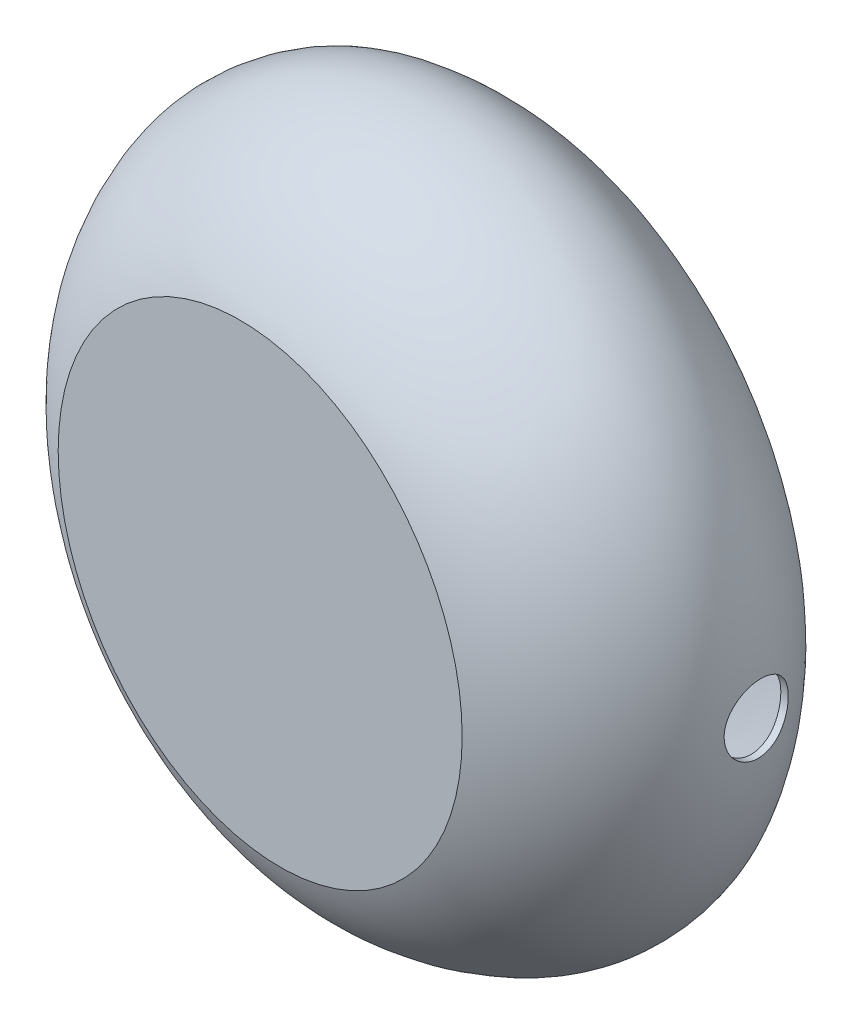
ISO-10303-21;
HEADER;
FILE_DESCRIPTION(('STEP AP214'),'2;1');
FILE_NAME('part.step','',(''),(''),'','','');
FILE_SCHEMA(('AUTOMOTIVE_DESIGN { 1 0 10303 214 1 1 1 1 }'));
ENDSEC;
DATA;
#1=APPLICATION_CONTEXT('core data for automotive mechanical design processes');
#2=APPLICATION_PROTOCOL_DEFINITION('international standard','automotive_design',2000,#1);
#3=PRODUCT_CONTEXT('',#1,'mechanical');
#4=PRODUCT('Part','Part','',(#3));
#5=PRODUCT_RELATED_PRODUCT_CATEGORY('part','',(#4));
#6=PRODUCT_DEFINITION_FORMATION('','',#4);
#7=PRODUCT_DEFINITION_CONTEXT('part definition',#1,'design');
#8=PRODUCT_DEFINITION('design','',#6,#7);
#9=PRODUCT_DEFINITION_SHAPE('','',#8);
#10=(LENGTH_UNIT() NAMED_UNIT(*) SI_UNIT(.MILLI.,.METRE.));
#11=(NAMED_UNIT(*) PLANE_ANGLE_UNIT() SI_UNIT($,.RADIAN.));
#12=(NAMED_UNIT(*) SI_UNIT($,.STERADIAN.) SOLID_ANGLE_UNIT());
#13=UNCERTAINTY_MEASURE_WITH_UNIT(LENGTH_MEASURE(1.E-05),#10,'distance_accuracy_value','');
#14=(GEOMETRIC_REPRESENTATION_CONTEXT(3) GLOBAL_UNCERTAINTY_ASSIGNED_CONTEXT((#13)) GLOBAL_UNIT_ASSIGNED_CONTEXT((#10,
#11,#12)) REPRESENTATION_CONTEXT('',''));
#15=CARTESIAN_POINT('',(0.,0.,0.));
#16=DIRECTION('',(0.,0.,1.));
#17=DIRECTION('',(1.,0.,0.));
#18=AXIS2_PLACEMENT_3D('',#15,#16,#17);
#19=CARTESIAN_POINT('',(10.9564172881335,0.,-41.4839206738087));
#20=CARTESIAN_POINT('',(16.7468170504935,0.,-39.8909410594247));
#21=CARTESIAN_POINT('',(24.4852706866185,0.,-37.3646570897723));
#22=CARTESIAN_POINT('',(29.4107737267656,0.,-31.1887789553887));
#23=CARTESIAN_POINT('',(30.237298128489,0.,-30.0002177019345));
#24=CARTESIAN_POINT('',(31.4004463307205,0.,-28.3275836183976));
#25=CARTESIAN_POINT('',(33.4006873198036,0.,-24.7555768155637));
#26=CARTESIAN_POINT('',(33.4337047002465,0.,-17.1975446517113));
#27=CARTESIAN_POINT('',(31.7953844898338,0.,-13.4401225330892));
#28=CARTESIAN_POINT('',(30.7823011503992,0.,-11.6725590504601));
#29=CARTESIAN_POINT('',(27.2189655886825,0.,-5.45547742442256));
#30=CARTESIAN_POINT('',(21.6184989610074,0.,-0.985104081791563));
#31=CARTESIAN_POINT('',(14.766271873074,0.,1.11166681785368));
#32=(BOUNDED_CURVE() B_SPLINE_CURVE(3,(#19,#20,#21,#22,#23,#24,#25,#26,#27,#28,#29,#30,#31),
.UNSPECIFIED.,.F.,.F.) B_SPLINE_CURVE_WITH_KNOTS((4,1,3,1,1,3,4),(0.,0.295285165363987,
0.366179967123908,0.465948541460828,0.565717115797749,0.66548569013467,1.),
.UNSPECIFIED.) CURVE() GEOMETRIC_REPRESENTATION_ITEM() RATIONAL_B_SPLINE_CURVE((1.,1.,1.,1.,1.,
1.,1.,1.,1.,1.,0.95325564469818,0.95325564469818,1.)) REPRESENTATION_ITEM(''));
#33=CARTESIAN_POINT('',(-17.3903051150952,0.,-2.12458306115281));
#34=DIRECTION('',(0.100134544269236,0.,-0.994973905710091));
#35=AXIS1_PLACEMENT('',#33,#34);
#36=SURFACE_OF_REVOLUTION('',#32,#35);
#37=CARTESIAN_POINT('',(-17.3903051150952,0.,-2.12458306115282));
#38=DIRECTION('',(0.100134544269236,0.,-0.994973905710091));
#39=DIRECTION('',(-0.994973905710091,0.,-0.100134544269236));
#40=AXIS2_PLACEMENT_3D('',#37,#38,#39);
#41=CIRCLE('',#40,32.3190154069616);
#42=CARTESIAN_POINT('',(-49.5468821032645,0.,-5.36083294015933));
#43=VERTEX_POINT('',#42);
#44=EDGE_CURVE('E10',#43,#43,#41,.T.);
#45=ORIENTED_EDGE('',*,*,#44,.F.);
#46=EDGE_LOOP('',(#45));
#47=FACE_BOUND('',#46,.T.);
#48=CARTESIAN_POINT('',(-13.1846542557873,0.,-43.9134871009767));
#49=DIRECTION('',(0.100134544269236,0.,-0.994973905710091));
#50=DIRECTION('',(-0.994973905710091,0.,-0.100134544269236));
#51=AXIS2_PLACEMENT_3D('',#48,#49,#50);
#52=CIRCLE('',#51,24.2630197690379);
#53=CARTESIAN_POINT('',(-37.3257257997082,0.,-46.3430535281448));
#54=VERTEX_POINT('',#53);
#55=EDGE_CURVE('E81',#54,#54,#52,.T.);
#56=ORIENTED_EDGE('',*,*,#55,.T.);
#57=EDGE_LOOP('',(#56));
#58=FACE_BOUND('',#57,.T.);
#59=CARTESIAN_POINT('',(-60.7749106932707,0.,-16.6272958596003));
#60=CARTESIAN_POINT('',(-60.7749096399128,-0.129203617777256,-16.6272940977474));
#61=CARTESIAN_POINT('',(-60.7771535630532,-0.258385904772437,-16.6324381064802));
#62=CARTESIAN_POINT('',(-60.7860878563745,-0.51580048474224,-16.6529534097548));
#63=CARTESIAN_POINT('',(-60.7927785550292,-0.64403270683002,-16.66832545982));
#64=CARTESIAN_POINT('',(-60.8104991159971,-0.898667338114445,-16.7091458110139));
#65=CARTESIAN_POINT('',(-60.8215320624063,-1.02506838040586,-16.7346012740034));
#66=CARTESIAN_POINT('',(-60.847761510242,-1.2751380790267,-16.7953389156611));
#67=CARTESIAN_POINT('',(-60.8629609384263,-1.39880474835001,-16.8306280022778));
#68=CARTESIAN_POINT('',(-60.897218749761,-1.64206216917799,-16.9105323766723));
#69=CARTESIAN_POINT('',(-60.9162639482248,-1.76166525810382,-16.9551158165363));
#70=CARTESIAN_POINT('',(-60.9579677860802,-1.99652722013193,-17.0532785504376));
#71=CARTESIAN_POINT('',(-60.9806280249427,-2.11178414223775,-17.1068618270006));
#72=CARTESIAN_POINT('',(-61.0292411231779,-2.3372374878662,-17.222544819889));
#73=CARTESIAN_POINT('',(-61.0551945415282,-2.44743304794869,-17.2846459821681));
#74=CARTESIAN_POINT('',(-61.1100529577688,-2.66214604348922,-17.4168490881426));
#75=CARTESIAN_POINT('',(-61.1389581460611,-2.76666311199272,-17.4869515479911));
#76=CARTESIAN_POINT('',(-61.2005950612155,-2.97359412972967,-17.6376148065858));
#77=CARTESIAN_POINT('',(-61.2334343722882,-3.07575131805919,-17.7184842505187));
#78=CARTESIAN_POINT('',(-61.3014999616087,-3.27271157133514,-17.8875992290074));
#79=CARTESIAN_POINT('',(-61.3367238040978,-3.36752193474281,-17.9758372575769));
#80=CARTESIAN_POINT('',(-61.4092270147946,-3.54950956341125,-18.1592040526729));
#81=CARTESIAN_POINT('',(-61.446507646506,-3.63668204962084,-18.2543370663618));
#82=CARTESIAN_POINT('',(-61.5227289318668,-3.80293312803277,-18.4508151531571));
#83=CARTESIAN_POINT('',(-61.561670066003,-3.88200935466016,-18.5521620280861));
#84=CARTESIAN_POINT('',(-61.6863230178173,-4.11764918711821,-18.8800715233461));
#85=CARTESIAN_POINT('',(-61.7744366943473,-4.25902614986149,-19.1168914581883));
#86=CARTESIAN_POINT('',(-61.9533453402419,-4.49966768864194,-19.6101394549343));
#87=CARTESIAN_POINT('',(-62.0441410791357,-4.59892005039145,-19.8665731785743));
#88=CARTESIAN_POINT('',(-62.1821619352874,-4.71626956880417,-20.2668635121856));
#89=CARTESIAN_POINT('',(-62.229528144917,-4.75050016552497,-20.4061241305685));
#90=CARTESIAN_POINT('',(-62.3238281180197,-4.8065890896272,-20.6873010538995));
#91=CARTESIAN_POINT('',(-62.3707618658976,-4.82844697253899,-20.8292174540629));
#92=CARTESIAN_POINT('',(-62.46385498847,-4.85956904075379,-21.1146915040591));
#93=CARTESIAN_POINT('',(-62.510014251643,-4.86883142749014,-21.2582493853354));
#94=CARTESIAN_POINT('',(-62.6010352363093,-4.87461130848888,-21.5460308902896));
#95=CARTESIAN_POINT('',(-62.6458970144458,-4.87112935996831,-21.6902544845854));
#96=CARTESIAN_POINT('',(-62.7338195960082,-4.85130983041162,-21.9784448147505));
#97=CARTESIAN_POINT('',(-62.7768795568198,-4.83496630392163,-22.1224114009583));
#98=CARTESIAN_POINT('',(-62.8607008561903,-4.78938017609429,-22.4089074413523));
#99=CARTESIAN_POINT('',(-62.9014631037105,-4.76014271648389,-22.5514374452557));
#100=CARTESIAN_POINT('',(-62.9803108486813,-4.68881055178381,-22.833990125196));
#101=CARTESIAN_POINT('',(-63.0183965797447,-4.64671697052587,-22.9740130192625));
#102=CARTESIAN_POINT('',(-63.0915833598892,-4.5498147109673,-23.2503919787251));
#103=CARTESIAN_POINT('',(-63.1266845491019,-4.49500663009508,-23.386748216074));
#104=CARTESIAN_POINT('',(-63.1921817988063,-4.37568004750764,-23.6485886676522));
#105=CARTESIAN_POINT('',(-63.2227181907765,-4.3117064922175,-23.7742862836768));
#106=CARTESIAN_POINT('',(-63.2807571577125,-4.17275566397929,-24.0201776571461));
#107=CARTESIAN_POINT('',(-63.3082598825906,-4.097778935193,-24.1403716863851));
#108=CARTESIAN_POINT('',(-63.3601943266556,-3.93730392050686,-24.3741932159403));
#109=CARTESIAN_POINT('',(-63.3846265560956,-3.85180738746772,-24.4878218055973));
#110=CARTESIAN_POINT('',(-63.430462077725,-3.67087139133999,-24.7075221356586));
#111=CARTESIAN_POINT('',(-63.451865457848,-3.57543221704597,-24.8135940954028));
#112=CARTESIAN_POINT('',(-63.4908381119302,-3.3798415205439,-25.0126194435651));
#113=CARTESIAN_POINT('',(-63.5085370162812,-3.28009838137202,-25.1059491875682));
#114=CARTESIAN_POINT('',(-63.5413922540522,-3.07284508526771,-25.2841179210953));
#115=CARTESIAN_POINT('',(-63.5565477302911,-2.96533232722847,-25.3689540442461));
#116=CARTESIAN_POINT('',(-63.5844515607627,-2.74338789255216,-25.5293683102011));
#117=CARTESIAN_POINT('',(-63.5972009615355,-2.62895925275554,-25.6049504730358));
#118=CARTESIAN_POINT('',(-63.6204670883235,-2.39392561922932,-25.746313510611));
#119=CARTESIAN_POINT('',(-63.6309829900949,-2.27331836567217,-25.8120907643171));
#120=CARTESIAN_POINT('',(-63.6497951724074,-2.02871353622651,-25.9323650997334));
#121=CARTESIAN_POINT('',(-63.6581226024912,-1.90479476850142,-25.9870176656018));
#122=CARTESIAN_POINT('',(-63.6729115564123,-1.65269462661644,-26.0858678602588));
#123=CARTESIAN_POINT('',(-63.6793723987743,-1.52451171465204,-26.1300616695824));
#124=CARTESIAN_POINT('',(-63.6905486291323,-1.26488863506134,-26.2076162136453));
#125=CARTESIAN_POINT('',(-63.6952646755957,-1.13344971623909,-26.240981034545));
#126=CARTESIAN_POINT('',(-63.7030570197118,-0.868153003616121,-26.2966585641112));
#127=CARTESIAN_POINT('',(-63.7061327105504,-0.734294333586563,-26.318967182559));
#128=CARTESIAN_POINT('',(-63.7107110970448,-0.465185524132252,-26.3523424821769));
#129=CARTESIAN_POINT('',(-63.7122141306411,-0.329935689958412,-26.3634115785369));
#130=CARTESIAN_POINT('',(-63.7136840328538,-0.0589256894406616,-26.374235436507));
#131=CARTESIAN_POINT('',(-63.7136503344279,0.0768346467981615,-26.373986021673));
#132=CARTESIAN_POINT('',(-63.7120448462578,0.34780340415199,-26.3621664569817));
#133=CARTESIAN_POINT('',(-63.7104736114855,0.4830120067323,-26.3506003918564));
#134=CARTESIAN_POINT('',(-63.7057560732085,0.752016805870351,-26.3162339604125));
#135=CARTESIAN_POINT('',(-63.7026091885405,0.885812462670174,-26.2934294489498));
#136=CARTESIAN_POINT('',(-63.6946664812246,1.15105983660741,-26.2367402137459));
#137=CARTESIAN_POINT('',(-63.689869795542,1.28251028900177,-26.202849691207));
#138=CARTESIAN_POINT('',(-63.678523710948,1.54210431005171,-26.1242363988432));
#139=CARTESIAN_POINT('',(-63.6719736652414,1.67024663921184,-26.0795096322254));
#140=CARTESIAN_POINT('',(-63.6569950565452,1.92221971318372,-25.9795834833931));
#141=CARTESIAN_POINT('',(-63.648567228573,2.04605212315172,-25.9243882001079));
#142=CARTESIAN_POINT('',(-63.6296870832857,2.28858528711819,-25.8039507659221));
#143=CARTESIAN_POINT('',(-63.6192340221569,2.40728413604487,-25.7387049255317));
#144=CARTESIAN_POINT('',(-63.584630354441,2.754007708643,-25.528823391271));
#145=CARTESIAN_POINT('',(-63.5572023049875,2.97324643874859,-25.3698098525766));
#146=CARTESIAN_POINT('',(-63.492442437464,3.3814912830071,-25.0187144274095));
#147=CARTESIAN_POINT('',(-63.4551111350434,3.57049897042944,-24.8266342628554));
#148=CARTESIAN_POINT('',(-63.3696650807132,3.9136096356528,-24.4152485397504));
#149=CARTESIAN_POINT('',(-63.3215402704853,4.06767978457561,-24.1959176722406));
#150=CARTESIAN_POINT('',(-63.2144434956571,4.33701048559021,-23.7370493887705));
#151=CARTESIAN_POINT('',(-63.1554709479239,4.45226895037074,-23.4975108868998));
#152=CARTESIAN_POINT('',(-63.0263900278776,4.6435861400147,-23.0008355103024));
#153=CARTESIAN_POINT('',(-62.9560978191674,4.7188898772084,-22.7434570011133));
#154=CARTESIAN_POINT('',(-62.8070699158672,4.82624850221842,-22.2220749523518));
#155=CARTESIAN_POINT('',(-62.728331843362,4.85829117529087,-21.9580695631055));
#156=CARTESIAN_POINT('',(-62.6042126595926,4.87434572940678,-21.5562016928079));
#157=CARTESIAN_POINT('',(-62.5608092241512,4.87396665901205,-21.4181589146974));
#158=CARTESIAN_POINT('',(-62.472952087261,4.86155128032182,-21.1428957456724));
#159=CARTESIAN_POINT('',(-62.4284983579618,4.84951466256572,-21.0056753766869));
#160=CARTESIAN_POINT('',(-62.3389494770136,4.81391535303279,-20.7329353511684));
#161=CARTESIAN_POINT('',(-62.2938542203206,4.7903507520671,-20.597415980158));
#162=CARTESIAN_POINT('',(-62.203319601261,4.73188940827025,-20.3289579956279));
#163=CARTESIAN_POINT('',(-62.1578802325061,4.69699245455126,-20.1960194301841));
#164=CARTESIAN_POINT('',(-62.0650412455124,4.61435563618196,-19.9279043775247));
#165=CARTESIAN_POINT('',(-62.0176415232668,4.56612719712984,-19.7928782619056));
#166=CARTESIAN_POINT('',(-61.9232313356996,4.45788693100056,-19.5274272428588));
#167=CARTESIAN_POINT('',(-61.8762210259901,4.39787060973063,-19.3970041167881));
#168=CARTESIAN_POINT('',(-61.7830556166661,4.26643862349757,-19.1417485160009));
#169=CARTESIAN_POINT('',(-61.7369003448568,4.19502528224097,-19.0169149082828));
#170=CARTESIAN_POINT('',(-61.645886623479,4.04117273268153,-18.773668154984));
#171=CARTESIAN_POINT('',(-61.6010286203728,3.95872978212725,-18.6552572078058));
#172=CARTESIAN_POINT('',(-61.5131135348129,3.78328481897341,-18.4257739228397));
#173=CARTESIAN_POINT('',(-61.4700567941057,3.69028081498827,-18.3147029753445));
#174=CARTESIAN_POINT('',(-61.3862784246842,3.49426326095011,-18.1008221799522));
#175=CARTESIAN_POINT('',(-61.3455566708447,3.39125024804969,-17.9980118892716));
#176=CARTESIAN_POINT('',(-61.2669788841194,3.17579122604909,-17.801505568661));
#177=CARTESIAN_POINT('',(-61.2291237393235,3.06334231622204,-17.7078123607075));
#178=CARTESIAN_POINT('',(-61.1568694352118,2.82980485373326,-17.5304997429667));
#179=CARTESIAN_POINT('',(-61.1224686446203,2.70872042573083,-17.4468755744504));
#180=CARTESIAN_POINT('',(-61.059226580118,2.46472854770807,-17.2942831819702));
#181=CARTESIAN_POINT('',(-61.0301972904463,2.34219008519248,-17.2248029135313));
#182=CARTESIAN_POINT('',(-60.9762414059783,2.0908883865717,-17.0964415403512));
#183=CARTESIAN_POINT('',(-60.9513127950661,1.96212824990844,-17.037555225706));
#184=CARTESIAN_POINT('',(-60.9060105247688,1.69945591163696,-16.9310670258885));
#185=CARTESIAN_POINT('',(-60.8856305713435,1.56555113347106,-16.8834495423033));
#186=CARTESIAN_POINT('',(-60.8497715001399,1.29354325606882,-16.7999758816391));
#187=CARTESIAN_POINT('',(-60.8342905875235,1.15544171475171,-16.7641153970309));
#188=CARTESIAN_POINT('',(-60.806066581056,0.84944058970874,-16.69889507929));
#189=CARTESIAN_POINT('',(-60.7944115936406,0.680888787201681,-16.6720860865873));
#190=CARTESIAN_POINT('',(-60.7788345495279,0.341545492035389,-16.6362881104394));
#191=CARTESIAN_POINT('',(-60.7749120853773,0.170754117864274,-16.6272981880462));
#192=CARTESIAN_POINT('',(-60.7749106932707,0.,-16.6272958596003));
#193=B_SPLINE_CURVE_WITH_KNOTS('',3,(#59,#60,#61,#62,#63,#64,#65,#66,#67,#68,#69,#70,#71,#72,
#73,#74,#75,#76,#77,#78,#79,#80,#81,#82,#83,#84,#85,#86,#87,#88,#89,#90,#91,#92,#93,#94,#95,#96,
#97,#98,#99,#100,#101,#102,#103,#104,#105,#106,#107,#108,#109,#110,#111,#112,#113,#114,#115,
#116,#117,#118,#119,#120,#121,#122,#123,#124,#125,#126,#127,#128,#129,#130,#131,#132,#133,#134,
#135,#136,#137,#138,#139,#140,#141,#142,#143,#144,#145,#146,#147,#148,#149,#150,#151,#152,#153,
#154,#155,#156,#157,#158,#159,#160,#161,#162,#163,#164,#165,#166,#167,#168,#169,#170,#171,#172,
#173,#174,#175,#176,#177,#178,#179,#180,#181,#182,#183,#184,#185,#186,#187,#188,#189,#190,#191,
#192),.UNSPECIFIED.,.T.,.F.,(4,2,2,2,2,2,2,2,2,2,2,2,2,2,2,2,2,2,2,2,2,2,2,2,2,2,2,2,2,2,2,2,2,
2,2,2,2,2,2,2,2,2,2,2,2,2,2,2,2,2,2,2,2,2,2,2,2,2,2,2,2,2,2,2,2,2,4),(0.,0.387452743267558,
0.774934110014652,1.16269118478705,1.5507213417981,1.9374431133302,2.32433646650519,
2.71129557823223,3.09827966629581,3.50094211794728,3.90319928839878,4.30570638170744,
4.70833074641227,5.57288639498031,6.43769255580716,6.89031931555966,7.34296233416178,
7.79566998088014,8.24835783422467,8.70125507220807,9.15397187097058,9.60664910632704,
10.0593050756102,10.4916846097481,10.9240427677646,11.3563289814835,11.7886026424904,
12.2013246120495,12.6141853982019,13.0268661915234,13.4396990156952,13.8462913366944,
14.25303191403,14.6596188348461,15.0663560595655,15.4730058645882,15.879805721502,
16.2864587986176,16.6932619764223,17.1002782833264,17.5074449414981,17.9144525021839,
18.3216098301579,19.1340504019797,19.9464486793921,20.7596071883481,21.5728094223824,
22.400875154556,23.2291746418909,23.662896536684,24.0966299453496,24.5304352104237,
24.9642485487989,25.4167535023242,25.8694313118265,26.3220169437517,26.7747565253782,
27.2275816174959,27.680382421297,28.1333229359672,28.5860485391222,29.0169591543106,
29.4476572731372,29.8777556824481,30.3076963357464,30.8197767167603,31.3318301137852),.UNSPECIFIED.);
#194=CARTESIAN_POINT('',(-60.7749106932707,0.,-16.6272958596003));
#195=VERTEX_POINT('',#194);
#196=EDGE_CURVE('E73',#195,#195,#193,.T.);
#197=ORIENTED_EDGE('',*,*,#196,.F.);
#198=EDGE_LOOP('',(#197));
#199=FACE_BOUND('',#198,.T.);
#200=CARTESIAN_POINT('',(32.2709583468155,0.,-26.3727041403997));
#201=CARTESIAN_POINT('',(32.2709559760742,-0.13361911325571,-26.3727072190581));
#202=CARTESIAN_POINT('',(32.272656586364,-0.267203144460643,-26.3672061842369));
#203=CARTESIAN_POINT('',(32.2794008134126,-0.533424016259303,-26.3452589356718));
#204=CARTESIAN_POINT('',(32.2844449894248,-0.666060694644302,-26.3288108909002));
#205=CARTESIAN_POINT('',(32.2977264400539,-0.929441723755104,-26.285103743743));
#206=CARTESIAN_POINT('',(32.3059653618946,-1.06018506213373,-26.2578390640885));
#207=CARTESIAN_POINT('',(32.3253863138996,-1.31883824783124,-26.1927286782248));
#208=CARTESIAN_POINT('',(32.3365694684071,-1.4467469924012,-26.1548789294459));
#209=CARTESIAN_POINT('',(32.3615125229732,-1.69852343474327,-26.0690170251779));
#210=CARTESIAN_POINT('',(32.3752666352711,-1.82239948947719,-26.0210276650342));
#211=CARTESIAN_POINT('',(32.4049689804619,-2.06564457988135,-25.915196139054));
#212=CARTESIAN_POINT('',(32.4209179808076,-2.18501202040596,-25.8573505252403));
#213=CARTESIAN_POINT('',(32.4545465124169,-2.41843098775623,-25.7322533672744));
#214=CARTESIAN_POINT('',(32.4722257904035,-2.53248328901148,-25.665003199139));
#215=CARTESIAN_POINT('',(32.5088227519277,-2.75460438225559,-25.5215520297643));
#216=CARTESIAN_POINT('',(32.5277404750266,-2.86267298289554,-25.4453507425258));
#217=CARTESIAN_POINT('',(32.5668396881004,-3.07512401072812,-25.2822338165356));
#218=CARTESIAN_POINT('',(32.5870417421795,-3.17931801426549,-25.1950775970107));
#219=CARTESIAN_POINT('',(32.6276338805167,-3.38001696173862,-25.012425939834));
#220=CARTESIAN_POINT('',(32.648023902995,-3.47652433810333,-24.9169331604933));
#221=CARTESIAN_POINT('',(32.6884494034395,-3.66129131785122,-24.7181682118865));
#222=CARTESIAN_POINT('',(32.7084848083226,-3.74954923678873,-24.6148944615756));
#223=CARTESIAN_POINT('',(32.7476453292852,-3.91721122587742,-24.401231082969));
#224=CARTESIAN_POINT('',(32.7667704440317,-3.99661528306415,-24.2908414442541));
#225=CARTESIAN_POINT('',(32.8040887369974,-4.14742517106179,-24.0615032978375));
#226=CARTESIAN_POINT('',(32.8222573672581,-4.21865078917862,-23.9424321882761));
#227=CARTESIAN_POINT('',(32.8570045098069,-4.35079744403803,-23.6984232867627));
#228=CARTESIAN_POINT('',(32.8735824424428,-4.41171473053853,-23.573483380731));
#229=CARTESIAN_POINT('',(32.9049181822213,-4.52270096090727,-23.31871378994));
#230=CARTESIAN_POINT('',(32.9196767201867,-4.57277426679122,-23.1888860960655));
#231=CARTESIAN_POINT('',(32.9472325560833,-4.66170120951424,-22.9251860352504));
#232=CARTESIAN_POINT('',(32.9600291419774,-4.70055077750512,-22.7913122208824));
#233=CARTESIAN_POINT('',(32.9833338970017,-4.76605444932549,-22.5230720845493));
#234=CARTESIAN_POINT('',(32.9938801475981,-4.79292161638507,-22.3887610693429));
#235=CARTESIAN_POINT('',(33.0129312195712,-4.83527488483565,-22.1181611899186));
#236=CARTESIAN_POINT('',(33.0214352899467,-4.85075680366322,-21.9818716175753));
#237=CARTESIAN_POINT('',(33.0363820117187,-4.87017309335528,-21.7084214363436));
#238=CARTESIAN_POINT('',(33.0428255830725,-4.87411262401582,-21.571261244138));
#239=CARTESIAN_POINT('',(33.0536832595386,-4.87040473024153,-21.2969658667311));
#240=CARTESIAN_POINT('',(33.0580966184646,-4.86275304999032,-21.1598307092123));
#241=CARTESIAN_POINT('',(33.0648996881178,-4.83608573192286,-20.8885850288514));
#242=CARTESIAN_POINT('',(33.067317194494,-4.8172326986721,-20.7544591851995));
#243=CARTESIAN_POINT('',(33.070318029829,-4.76841503659451,-20.4881734493536));
#244=CARTESIAN_POINT('',(33.0709006893647,-4.73844635680598,-20.3560142921806));
#245=CARTESIAN_POINT('',(33.0703421452967,-4.66762346672729,-20.0947048215907));
#246=CARTESIAN_POINT('',(33.0692016062333,-4.62677345775348,-19.965553367774));
#247=CARTESIAN_POINT('',(33.0653355166607,-4.53445834415066,-19.7110726788389));
#248=CARTESIAN_POINT('',(33.0626093786908,-4.48298930976093,-19.5857448784974));
#249=CARTESIAN_POINT('',(33.0557353622413,-4.36980815513183,-19.3398276028079));
#250=CARTESIAN_POINT('',(33.0515873320507,-4.30809494223725,-19.2192386346077));
#251=CARTESIAN_POINT('',(33.0420575721191,-4.17484824681133,-18.9836103967701));
#252=CARTESIAN_POINT('',(33.0366753896384,-4.10331116433839,-18.8685731825452));
#253=CARTESIAN_POINT('',(33.0248934490482,-3.9509547364074,-18.6449176023407));
#254=CARTESIAN_POINT('',(33.0184940170507,-3.87013836801978,-18.5362971945032));
#255=CARTESIAN_POINT('',(33.0049152732362,-3.69977714914992,-18.3261657061545));
#256=CARTESIAN_POINT('',(32.997735672245,-3.61022906347637,-18.2246572848298));
#257=CARTESIAN_POINT('',(32.9752816182464,-3.32776876971073,-17.9302051448158));
#258=CARTESIAN_POINT('',(32.959192477548,-3.12225695636023,-17.7491192412942));
#259=CARTESIAN_POINT('',(32.9272296216432,-2.68394338390753,-17.423938815741));
#260=CARTESIAN_POINT('',(32.9113559162684,-2.45114038399206,-17.2798459765763));
#261=CARTESIAN_POINT('',(32.8823146692562,-1.96315822612658,-17.0318312802257));
#262=CARTESIAN_POINT('',(32.869162945599,-1.70785992793403,-16.9281412992717));
#263=CARTESIAN_POINT('',(32.8478359456881,-1.18327620900216,-16.7651775309328));
#264=CARTESIAN_POINT('',(32.8396603321989,-0.913991737461243,-16.7059007335631));
#265=CARTESIAN_POINT('',(32.829647895319,-0.370995379202318,-16.6337786639218));
#266=CARTESIAN_POINT('',(32.8277689242834,-0.0973253020947404,-16.6206246334812));
#267=CARTESIAN_POINT('',(32.8305340634828,0.448317859481155,-16.6402898455779));
#268=CARTESIAN_POINT('',(32.8351779982298,0.72029098940533,-16.6731078513128));
#269=CARTESIAN_POINT('',(32.8501967504864,1.253234613576,-16.7834031877436));
#270=CARTESIAN_POINT('',(32.8605389510318,1.51425871292613,-16.8606264508579));
#271=CARTESIAN_POINT('',(32.8852929602555,2.01968299846165,-17.0572901680472));
#272=CARTESIAN_POINT('',(32.8997050174192,2.26408216847925,-17.1767331999668));
#273=CARTESIAN_POINT('',(32.9303776669971,2.73124292545018,-17.4554885081377));
#274=CARTESIAN_POINT('',(32.9466507893756,2.95383654818821,-17.6150808986166));
#275=CARTESIAN_POINT('',(32.9784172718645,3.36923686752588,-17.9692785262865));
#276=CARTESIAN_POINT('',(32.9939106149346,3.56204291337607,-18.1638845281957));
#277=CARTESIAN_POINT('',(33.0219597384956,3.91337956033313,-18.5838324241056));
#278=CARTESIAN_POINT('',(33.0344999445561,4.07172811870456,-18.8093277717229));
#279=CARTESIAN_POINT('',(33.0546069470177,4.34829392419063,-19.2839206187862));
#280=CARTESIAN_POINT('',(33.0621739302246,4.46651267859241,-19.5330172313121));
#281=CARTESIAN_POINT('',(33.0707978657857,4.65867800907714,-20.0458892207933));
#282=CARTESIAN_POINT('',(33.0718993329717,4.73292414111604,-20.3095515795424));
#283=CARTESIAN_POINT('',(33.0666574764508,4.83625414509139,-20.8455068259205));
#284=CARTESIAN_POINT('',(33.0603145468592,4.86534040765659,-21.1177992559205));
#285=CARTESIAN_POINT('',(33.0396691173446,4.87755342684858,-21.6608246938241));
#286=CARTESIAN_POINT('',(33.0254334456983,4.86106148673912,-21.9315517662643));
#287=CARTESIAN_POINT('',(32.9889595838281,4.78361752375637,-22.465999429235));
#288=CARTESIAN_POINT('',(32.9667216338858,4.72266683577356,-22.729720229885));
#289=CARTESIAN_POINT('',(32.9147154010475,4.558226121045,-23.2431586221072));
#290=CARTESIAN_POINT('',(32.8849364423753,4.45467565506292,-23.4928557429356));
#291=CARTESIAN_POINT('',(32.8190938795394,4.20823209850711,-23.9711124259127));
#292=CARTESIAN_POINT('',(32.7830297375842,4.06533564068685,-24.1996701767078));
#293=CARTESIAN_POINT('',(32.7061873434721,3.74187644303728,-24.6330342719369));
#294=CARTESIAN_POINT('',(32.6653450696738,3.56076774119171,-24.837420833771));
#295=CARTESIAN_POINT('',(32.5837667997626,3.16681151134117,-25.2132996895092));
#296=CARTESIAN_POINT('',(32.5430308456176,2.95395295146512,-25.3847805023719));
#297=CARTESIAN_POINT('',(32.4851706835418,2.61329331728249,-25.6150022134798));
#298=CARTESIAN_POINT('',(32.4662723926162,2.49503473276981,-25.6877623299644));
#299=CARTESIAN_POINT('',(32.4302743744249,2.25254558039439,-25.8230228130909));
#300=CARTESIAN_POINT('',(32.4131739576318,2.12831732887167,-25.8855271182742));
#301=CARTESIAN_POINT('',(32.381319946121,1.8748182438891,-25.9997352948908));
#302=CARTESIAN_POINT('',(32.3665645754385,1.74555131963414,-26.0514473489636));
#303=CARTESIAN_POINT('',(32.3398600140719,1.48284936584619,-26.1436824256018));
#304=CARTESIAN_POINT('',(32.327910198834,1.34941527148861,-26.1842079387933));
#305=CARTESIAN_POINT('',(32.3024099162084,1.01664129800638,-26.2698343468525));
#306=CARTESIAN_POINT('',(32.2906853072931,0.815423419136084,-26.3083478116515));
#307=CARTESIAN_POINT('',(32.2749615999025,0.409442759904315,-26.3597794839705));
#308=CARTESIAN_POINT('',(32.2709619783609,0.204680220502528,-26.3726994244541));
#309=CARTESIAN_POINT('',(32.2709583468155,0.,-26.3727041403997));
#310=B_SPLINE_CURVE_WITH_KNOTS('',3,(#200,#201,#202,#203,#204,#205,#206,#207,#208,#209,#210,
#211,#212,#213,#214,#215,#216,#217,#218,#219,#220,#221,#222,#223,#224,#225,#226,#227,#228,#229,
#230,#231,#232,#233,#234,#235,#236,#237,#238,#239,#240,#241,#242,#243,#244,#245,#246,#247,#248,
#249,#250,#251,#252,#253,#254,#255,#256,#257,#258,#259,#260,#261,#262,#263,#264,#265,#266,#267,
#268,#269,#270,#271,#272,#273,#274,#275,#276,#277,#278,#279,#280,#281,#282,#283,#284,#285,#286,
#287,#288,#289,#290,#291,#292,#293,#294,#295,#296,#297,#298,#299,#300,#301,#302,#303,#304,#305,
#306,#307,#308,#309),.UNSPECIFIED.,.T.,.F.,(4,2,2,2,2,2,2,2,2,2,2,2,2,2,2,2,2,2,2,2,2,2,2,2,2,2,
2,2,2,2,2,2,2,2,2,2,2,2,2,2,2,2,2,2,2,2,2,2,2,2,2,2,2,2,4),(0.,0.400673229506152,
0.801413493589136,1.20236065631967,1.6034611553763,2.00366933741992,2.40401781135641,
2.80430776993092,3.20461052173717,3.61614167724003,4.02754208220384,4.43902630779126,
4.85051113589506,5.26979853952214,5.68923815636818,6.1085087379946,6.52793112411174,
6.93956520567629,7.35135043254098,7.76295155086734,8.17470382884458,8.58062012234872,
8.98668449267453,9.39259230692004,9.79865060493313,10.2047522414283,10.6110030923263,
11.0171239681745,11.423395891926,12.2423459603527,13.0613332773797,13.8849539539783,
14.7085188068384,15.5265598581272,16.3445789017845,17.1579635169115,17.9713978040654,
18.7906727759947,19.6099656435511,20.4334871436239,21.2569777085653,22.0747918601239,
22.8925627175649,23.7035129327213,24.5144387997974,25.3265191728811,26.1386690657572,
26.9633209546595,27.7882600491742,28.2082235250079,28.6280253427798,29.047507702855,
29.4668965918592,30.0806967923304,30.6944554303468),.UNSPECIFIED.);
#311=CARTESIAN_POINT('',(32.2709583468155,0.,-26.3727041403997));
#312=VERTEX_POINT('',#311);
#313=EDGE_CURVE('E77',#312,#312,#310,.T.);
#314=ORIENTED_EDGE('',*,*,#313,.F.);
#315=EDGE_LOOP('',(#314));
#316=FACE_BOUND('',#315,.T.);
#317=ADVANCED_FACE('F32',(#47,#58,#199,#316),#36,.T.);
#318=CARTESIAN_POINT('',(14.8664064173432,0.,2.12679587918839));
#319=CARTESIAN_POINT('',(15.5013499309246,0.,1.93250414525849));
#320=CARTESIAN_POINT('',(16.7556959671913,0.,1.51710962069489));
#321=CARTESIAN_POINT('',(19.2526970369528,0.,0.477498508337025));
#322=CARTESIAN_POINT('',(22.2561399340122,0.,-1.15857760024575));
#323=CARTESIAN_POINT('',(25.5708586255379,0.,-3.63867720952334));
#324=CARTESIAN_POINT('',(28.4903462188145,0.,-6.55437241165982));
#325=CARTESIAN_POINT('',(30.9260750825759,0.,-9.82283174932145));
#326=CARTESIAN_POINT('',(32.8726124959348,0.,-13.2760913992768));
#327=CARTESIAN_POINT('',(34.1979719897751,0.,-17.3119460343503));
#328=CARTESIAN_POINT('',(34.4104187172846,0.,-21.2826463616361));
#329=CARTESIAN_POINT('',(34.0018815101673,0.,-24.3442307469436));
#330=CARTESIAN_POINT('',(33.1591181709436,0.,-27.1572448742796));
#331=CARTESIAN_POINT('',(31.8171303589746,0.,-29.5229074717535));
#332=CARTESIAN_POINT('',(30.2805696558034,0.,-31.6772854503223));
#333=CARTESIAN_POINT('',(28.9642652985328,0.,-33.2881138959501));
#334=CARTESIAN_POINT('',(27.4967175503177,0.,-34.7818726367158));
#335=CARTESIAN_POINT('',(24.3247639939979,0.,-37.4218307423605));
#336=CARTESIAN_POINT('',(20.0627137093958,0.,-39.611761078416));
#337=CARTESIAN_POINT('',(15.6202821372245,0.,-41.1621412443979));
#338=CARTESIAN_POINT('',(13.0865337976009,0.,-41.9278063123553));
#339=CARTESIAN_POINT('',(11.8467595952703,0.,-42.2761330636821));
#340=CARTESIAN_POINT('',(11.2216697000816,0.,-42.4480996810245));
#341=B_SPLINE_CURVE_WITH_KNOTS('',3,(#318,#319,#320,#321,#322,#323,#324,#325,#326,#327,#328,
#329,#330,#331,#332,#333,#334,#335,#336,#337,#338,#339,#340),.UNSPECIFIED.,.F.,.F.,(4,1,1,1,1,1,
1,1,1,1,1,1,1,1,1,1,1,1,1,1,4),(0.,0.0313526758611148,0.0627053517222296,0.125410703444459,
0.188116055166689,0.250821406888918,0.313526758611148,0.376232110333377,0.438937462055607,
0.501642813777837,0.532995489638951,0.564348165500066,0.627053517222296,0.658406193083411,
0.689758868944525,0.72111154480564,0.752464220666755,0.877874924111214,0.940580275833444,
0.971932951694559,1.00328562755567),.UNSPECIFIED.);
#342=CARTESIAN_POINT('',(-17.3903051150952,0.,-2.12458306115281));
#343=DIRECTION('',(0.100134544269236,0.,-0.994973905710091));
#344=AXIS1_PLACEMENT('',#342,#343);
#345=SURFACE_OF_REVOLUTION('',#341,#344);
#346=CARTESIAN_POINT('',(-13.0859322212154,0.,-44.8944257873659));
#347=DIRECTION('',(0.100134544269236,0.,-0.994973905710091));
#348=DIRECTION('',(-0.994973905710091,0.,-0.100134544269236));
#349=AXIS2_PLACEMENT_3D('',#346,#347,#348);
#350=CIRCLE('',#349,24.4303913718715);
#351=CARTESIAN_POINT('',(-37.3935341425125,0.,-47.3407518937073));
#352=VERTEX_POINT('',#351);
#353=EDGE_CURVE('E50',#352,#352,#350,.T.);
#354=ORIENTED_EDGE('',*,*,#353,.F.);
#355=EDGE_LOOP('',(#354));
#356=FACE_BOUND('',#355,.T.);
#357=CARTESIAN_POINT('',(-17.4904396593645,0.,-1.12960915544273));
#358=DIRECTION('',(0.100134544269236,0.,-0.994973905710091));
#359=DIRECTION('',(-0.994973905710091,0.,-0.100134544269236));
#360=AXIS2_PLACEMENT_3D('',#357,#358,#359);
#361=CIRCLE('',#360,32.5202961515009);
#362=CARTESIAN_POINT('',(-49.8472857360722,0.,-4.38601419007385));
#363=VERTEX_POINT('',#362);
#364=EDGE_CURVE('E45',#363,#363,#361,.T.);
#365=ORIENTED_EDGE('',*,*,#364,.T.);
#366=EDGE_LOOP('',(#365));
#367=FACE_BOUND('',#366,.T.);
#368=CARTESIAN_POINT('',(-61.9035012751079,0.,-16.6272958596003));
#369=CARTESIAN_POINT('',(-61.903500304875,0.129858875333419,-16.627294141402));
#370=CARTESIAN_POINT('',(-61.9056463153992,0.259696469395672,-16.6324902721275));
#371=CARTESIAN_POINT('',(-61.9141930088653,0.518444943589272,-16.6532172421244));
#372=CARTESIAN_POINT('',(-61.9205947301945,0.647355589785112,-16.6687506036664));
#373=CARTESIAN_POINT('',(-61.9375559858994,0.903356964179441,-16.7100086682241));
#374=CARTESIAN_POINT('',(-61.9481187661712,1.0304461911493,-16.7357413274507));
#375=CARTESIAN_POINT('',(-61.9732363063748,1.28184582415323,-16.7971425224458));
#376=CARTESIAN_POINT('',(-61.9877925957148,1.40615514579094,-16.8328148649322));
#377=CARTESIAN_POINT('',(-62.0206295591778,1.65077135273154,-16.9136353783991));
#378=CARTESIAN_POINT('',(-62.0389000192313,1.77108818402122,-16.9587575720976));
#379=CARTESIAN_POINT('',(-62.0789243831283,2.00731630701934,-17.0581114547805));
#380=CARTESIAN_POINT('',(-62.1006795775818,2.12322594671827,-17.1123465191835));
#381=CARTESIAN_POINT('',(-62.1707227132757,2.46315064701814,-17.2879883414816));
#382=CARTESIAN_POINT('',(-62.2238243159949,2.67962480528592,-17.4224195586627));
#383=CARTESIAN_POINT('',(-62.3423623042908,3.0946113033334,-17.7270217615935));
#384=CARTESIAN_POINT('',(-62.4081770742944,3.29218398517925,-17.8983148107001));
#385=CARTESIAN_POINT('',(-62.5479530479991,3.65619995395777,-18.2684617042961));
#386=CARTESIAN_POINT('',(-62.6219164372392,3.82263485698155,-18.4673229465556));
#387=CARTESIAN_POINT('',(-62.7805143516507,4.13125673929927,-18.9016121964135));
#388=CARTESIAN_POINT('',(-62.8655321606283,4.27105016938129,-19.1386020858135));
#389=CARTESIAN_POINT('',(-63.0387901980157,4.50863564411756,-19.6317289409928));
#390=CARTESIAN_POINT('',(-63.1270315265961,4.60641320087887,-19.8878724756368));
#391=CARTESIAN_POINT('',(-63.3068167812342,4.76120771179069,-20.424971324234));
#392=CARTESIAN_POINT('',(-63.3983309272656,4.8161955597341,-20.7065243658265));
#393=CARTESIAN_POINT('',(-63.5766575157239,4.87599444772954,-21.2764036509544));
#394=CARTESIAN_POINT('',(-63.6634700248644,4.88080619993653,-21.5647297983001));
#395=CARTESIAN_POINT('',(-63.8288281838926,4.83914995982634,-22.1391422257504));
#396=CARTESIAN_POINT('',(-63.9073987000737,4.79284137458046,-22.4252326828927));
#397=CARTESIAN_POINT('',(-64.0543200106629,4.64928202626384,-22.9870874183034));
#398=CARTESIAN_POINT('',(-64.122673387224,4.55204416250225,-23.2628542923757));
#399=CARTESIAN_POINT('',(-64.2450588808209,4.313678048387,-23.7833914466978));
#400=CARTESIAN_POINT('',(-64.2995754615213,4.17458632673518,-24.0289803316344));
#401=CARTESIAN_POINT('',(-64.3973732371038,3.85478684013616,-24.4938947467001));
#402=CARTESIAN_POINT('',(-64.4406569760918,3.6740885161205,-24.7132262177503));
#403=CARTESIAN_POINT('',(-64.5150036062648,3.28371681803386,-25.1104120258157));
#404=CARTESIAN_POINT('',(-64.5464649808594,3.07538918824674,-25.289516301228));
#405=CARTESIAN_POINT('',(-64.6003172976172,2.63083015387412,-25.6106130256951));
#406=CARTESIAN_POINT('',(-64.6227089269122,2.39460086489422,-25.7526082858713));
#407=CARTESIAN_POINT('',(-64.6592868411499,1.9045809753343,-25.9932497291666));
#408=CARTESIAN_POINT('',(-64.673583853157,1.65108330319018,-26.0924762203901));
#409=CARTESIAN_POINT('',(-64.6954173927295,1.1308478444225,-26.2474296490236));
#410=CARTESIAN_POINT('',(-64.7029539989631,0.864110211905538,-26.3031570926149));
#411=CARTESIAN_POINT('',(-64.7118737250244,0.325203759582812,-26.3694079694478));
#412=CARTESIAN_POINT('',(-64.7132618918875,0.0530395786725683,-26.3799684783776));
#413=CARTESIAN_POINT('',(-64.710019869677,-0.489219798274326,-26.3556737385227));
#414=CARTESIAN_POINT('',(-64.7053896586008,-0.759314986743367,-26.320818323703));
#415=CARTESIAN_POINT('',(-64.6897129488116,-1.28992788353026,-26.2066989940563));
#416=CARTESIAN_POINT('',(-64.6786627350737,-1.55043995355392,-26.1274093676882));
#417=CARTESIAN_POINT('',(-64.6493208138255,-2.05430591770629,-25.9268045553036));
#418=CARTESIAN_POINT('',(-64.6310292705065,-2.29766020072643,-25.8054903221685));
#419=CARTESIAN_POINT('',(-64.5861644205862,-2.76013150403661,-25.524679284736));
#420=CARTESIAN_POINT('',(-64.5595975534196,-2.97926719098704,-25.3652121913466));
#421=CARTESIAN_POINT('',(-64.4971652047481,-3.38740298561354,-25.0130324116641));
#422=CARTESIAN_POINT('',(-64.461300054793,-3.5764041674106,-24.820320910852));
#423=CARTESIAN_POINT('',(-64.3795331486543,-3.9195944120049,-24.4072779959838));
#424=CARTESIAN_POINT('',(-64.3336116694125,-4.07371383753165,-24.186892673936));
#425=CARTESIAN_POINT('',(-64.2317370994495,-4.34295593577118,-23.7256069433685));
#426=CARTESIAN_POINT('',(-64.175783347424,-4.45807603629183,-23.4847051830022));
#427=CARTESIAN_POINT('',(-64.0535961267588,-4.6486761403574,-22.9851749508641));
#428=CARTESIAN_POINT('',(-63.987202026283,-4.72343832420536,-22.7263124257527));
#429=CARTESIAN_POINT('',(-63.8461382277632,-4.82928498018191,-22.2020184710549));
#430=CARTESIAN_POINT('',(-63.7714669913899,-4.86036131843838,-21.936585827537));
#431=CARTESIAN_POINT('',(-63.6128398123119,-4.87938256388861,-21.395792716762));
#432=CARTESIAN_POINT('',(-63.5286367102309,-4.86561594776989,-21.1204446001857));
#433=CARTESIAN_POINT('',(-63.3564922346245,-4.79236712495915,-20.5771170783408));
#434=CARTESIAN_POINT('',(-63.2685498065624,-4.73287194037341,-20.3091397872995));
#435=CARTESIAN_POINT('',(-63.0887944424026,-4.56640525400318,-19.775976883704));
#436=CARTESIAN_POINT('',(-62.9969721857657,-4.45756785488345,-19.5113675296521));
#437=CARTESIAN_POINT('',(-62.8624345218289,-4.26054569908198,-19.1311475185028));
#438=CARTESIAN_POINT('',(-62.8180965694371,-4.18919298330868,-19.0071230471915));
#439=CARTESIAN_POINT('',(-62.7308675470051,-4.03560919207196,-18.7654864222295));
#440=CARTESIAN_POINT('',(-62.6879758995896,-3.95338252366606,-18.6478716979254));
#441=CARTESIAN_POINT('',(-62.6039791335445,-3.77830674194999,-18.4196782335891));
#442=CARTESIAN_POINT('',(-62.5628784663964,-3.68543303624547,-18.3091167397467));
#443=CARTESIAN_POINT('',(-62.4830483588894,-3.48980258915765,-18.0962660396274));
#444=CARTESIAN_POINT('',(-62.4443179119164,-3.38705009156245,-17.9939733156617));
#445=CARTESIAN_POINT('',(-62.3696740956171,-3.17220167510921,-17.7984474216847));
#446=CARTESIAN_POINT('',(-62.3337622418537,-3.06010079552152,-17.7052191192832));
#447=CARTESIAN_POINT('',(-62.2652908793445,-2.82738557736328,-17.5287982142295));
#448=CARTESIAN_POINT('',(-62.232729744977,-2.7067754154547,-17.4456007416653));
#449=CARTESIAN_POINT('',(-62.1728845130759,-2.46371620065914,-17.2937063774935));
#450=CARTESIAN_POINT('',(-62.1454239236075,-2.34162238435795,-17.2245105394591));
#451=CARTESIAN_POINT('',(-62.0944081886662,-2.09132108233418,-17.0966649556505));
#452=CARTESIAN_POINT('',(-62.0708511663207,-1.96311657309629,-17.0380101404977));
#453=CARTESIAN_POINT('',(-62.0280438650056,-1.70165341057995,-16.9319043909908));
#454=CARTESIAN_POINT('',(-62.0087879106226,-1.56840169225751,-16.8844386875655));
#455=CARTESIAN_POINT('',(-61.9748894297388,-1.29778827779882,-16.8011672036004));
#456=CARTESIAN_POINT('',(-61.9602452832842,-1.1604280434349,-16.7653573286601));
#457=CARTESIAN_POINT('',(-61.9333385397228,-0.85424449088345,-16.699711302107));
#458=CARTESIAN_POINT('',(-61.9221757270918,-0.684732402977545,-16.6725951819217));
#459=CARTESIAN_POINT('',(-61.9072579136513,-0.343467734561303,-16.6363890283254));
#460=CARTESIAN_POINT('',(-61.9035025580682,-0.171715261748862,-16.627298131612));
#461=CARTESIAN_POINT('',(-61.9035012751079,0.,-16.6272958596003));
#462=B_SPLINE_CURVE_WITH_KNOTS('',3,(#368,#369,#370,#371,#372,#373,#374,#375,#376,#377,#378,
#379,#380,#381,#382,#383,#384,#385,#386,#387,#388,#389,#390,#391,#392,#393,#394,#395,#396,#397,
#398,#399,#400,#401,#402,#403,#404,#405,#406,#407,#408,#409,#410,#411,#412,#413,#414,#415,#416,
#417,#418,#419,#420,#421,#422,#423,#424,#425,#426,#427,#428,#429,#430,#431,#432,#433,#434,#435,
#436,#437,#438,#439,#440,#441,#442,#443,#444,#445,#446,#447,#448,#449,#450,#451,#452,#453,#454,
#455,#456,#457,#458,#459,#460,#461),.UNSPECIFIED.,.T.,.F.,(4,2,2,2,2,2,2,2,2,2,2,2,2,2,2,2,2,2,
2,2,2,2,2,2,2,2,2,2,2,2,2,2,2,2,2,2,2,2,2,2,2,2,2,2,2,2,4),(0.,0.389418705083079,
0.778932462665488,1.16875066986445,1.55871837603698,1.94762782567575,2.33668164670713,
3.11395955645727,3.91950797644253,4.72527298076884,5.58540116752984,6.44582570573767,
7.34491516687306,8.24399186711351,9.14027290185403,10.0363270372621,10.8943753131378,
11.7522290812821,12.5778110557488,13.4033304717151,14.2172663607334,15.0311927781606,
15.8444509483175,16.6577120916532,17.4714443094042,18.2851580774984,19.0982402302325,
19.9112933948036,20.7259556801861,21.5406716859895,22.369437294734,23.1983571910045,
24.0592797230758,24.9204466775922,25.8173135125179,26.2662658610898,26.7150368101569,
27.1648660428119,27.6145028914233,28.0643798774315,28.514037563579,28.9424802221977,
29.3707162799629,29.7983838820991,30.2259010927844,30.7408627199475,31.2557996828741),.UNSPECIFIED.);
#463=CARTESIAN_POINT('',(-61.9035012751079,0.,-16.6272958596003));
#464=VERTEX_POINT('',#463);
#465=EDGE_CURVE('E53',#464,#464,#462,.T.);
#466=ORIENTED_EDGE('',*,*,#465,.F.);
#467=EDGE_LOOP('',(#466));
#468=FACE_BOUND('',#467,.T.);
#469=CARTESIAN_POINT('',(33.8545349022617,0.,-16.6272958596003));
#470=CARTESIAN_POINT('',(33.8545337837995,-0.1364035610465,-16.6272934940063));
#471=CARTESIAN_POINT('',(33.855280722555,-0.272775617671856,-16.6330248975734));
#472=CARTESIAN_POINT('',(33.8582362998902,-0.544584073008781,-16.6559038076365));
#473=CARTESIAN_POINT('',(33.8604452018587,-0.680020298676506,-16.6730533712443));
#474=CARTESIAN_POINT('',(33.866239642596,-0.949020292855414,-16.7186580547658));
#475=CARTESIAN_POINT('',(33.8698259646907,-1.08258295100566,-16.7471196080244));
#476=CARTESIAN_POINT('',(33.8782324114643,-1.34686223704878,-16.8151487450513));
#477=CARTESIAN_POINT('',(33.8830529864904,-1.4775778071822,-16.8547203831143));
#478=CARTESIAN_POINT('',(33.8937272946016,-1.73505746243193,-16.9446297918975));
#479=CARTESIAN_POINT('',(33.8995799666089,-1.86182544998394,-16.9949565166838));
#480=CARTESIAN_POINT('',(33.9120862870822,-2.11071163379545,-17.1060586153665));
#481=CARTESIAN_POINT('',(33.9187402307439,-2.23282809444802,-17.1668378436095));
#482=CARTESIAN_POINT('',(33.9325702723991,-2.47145605621506,-17.2983690602664));
#483=CARTESIAN_POINT('',(33.9397461108058,-2.58797029657277,-17.3691161069494));
#484=CARTESIAN_POINT('',(33.9543248782205,-2.81469693163348,-17.5201398221699));
#485=CARTESIAN_POINT('',(33.961727890486,-2.92490697246868,-17.6004200162309));
#486=CARTESIAN_POINT('',(33.9765106610363,-3.13876375552561,-17.7703676818837));
#487=CARTESIAN_POINT('',(33.9838901059114,-3.2423739825257,-17.8600811363832));
#488=CARTESIAN_POINT('',(33.9983075273442,-3.44172148558933,-18.0479621283312));
#489=CARTESIAN_POINT('',(34.0053453764473,-3.53745583215649,-18.1461327839569));
#490=CARTESIAN_POINT('',(34.0188055385552,-3.72030012782935,-18.3501789557434));
#491=CARTESIAN_POINT('',(34.0252280665714,-3.8074130898531,-18.45605175763));
#492=CARTESIAN_POINT('',(34.0372136792575,-3.97246190225445,-18.674831812354));
#493=CARTESIAN_POINT('',(34.0427764473421,-4.05039436964054,-18.7877416350278));
#494=CARTESIAN_POINT('',(34.0528116639154,-4.19644962902897,-19.0197111456156));
#495=CARTESIAN_POINT('',(34.0572846126408,-4.26457691579619,-19.1387679814673));
#496=CARTESIAN_POINT('',(34.0649456652805,-4.39059262653885,-19.3822787082627));
#497=CARTESIAN_POINT('',(34.0681332921661,-4.44847724463256,-19.5067345840363));
#498=CARTESIAN_POINT('',(34.0730487230975,-4.55353086453513,-19.7600586756347));
#499=CARTESIAN_POINT('',(34.0747771262391,-4.60070425810201,-19.8889250580575));
#500=CARTESIAN_POINT('',(34.0766349345671,-4.68403580217566,-20.1502330722442));
#501=CARTESIAN_POINT('',(34.0767637533604,-4.72018990837451,-20.2826759973063));
#502=CARTESIAN_POINT('',(34.0753141029181,-4.78093597407752,-20.5490087477682));
#503=CARTESIAN_POINT('',(34.073750065633,-4.80562314576716,-20.6828768586167));
#504=CARTESIAN_POINT('',(34.0688623660923,-4.84372597931649,-20.952189426395));
#505=CARTESIAN_POINT('',(34.0655380575779,-4.85713749679583,-21.0876344443908));
#506=CARTESIAN_POINT('',(34.0528398914615,-4.88025718305492,-21.4947660951242));
#507=CARTESIAN_POINT('',(34.0407394831098,-4.87291801237926,-21.7675468033097));
#508=CARTESIAN_POINT('',(34.009361179901,-4.81313393060649,-22.3064087624279));
#509=CARTESIAN_POINT('',(33.99011262318,-4.7608722578883,-22.5725127155671));
#510=CARTESIAN_POINT('',(33.9446840182171,-4.61323852308456,-23.0918877098321));
#511=CARTESIAN_POINT('',(33.9185040538803,-4.51786698283588,-23.3451589062547));
#512=CARTESIAN_POINT('',(33.8600092280534,-4.28623746398319,-23.8334450795368));
#513=CARTESIAN_POINT('',(33.8276559706594,-4.14972031718959,-24.068332082687));
#514=CARTESIAN_POINT('',(33.7587688814284,-3.8398675189414,-24.5119428874979));
#515=CARTESIAN_POINT('',(33.7222342893236,-3.66652516685216,-24.7206619166853));
#516=CARTESIAN_POINT('',(33.6668613815096,-3.38108708254316,-25.0114721818876));
#517=CARTESIAN_POINT('',(33.648147074638,-3.28073928090874,-25.1053975605117));
#518=CARTESIAN_POINT('',(33.6111353367473,-3.07243900926407,-25.2844676746508));
#519=CARTESIAN_POINT('',(33.5928377561611,-2.96448932643269,-25.3696156004381));
#520=CARTESIAN_POINT('',(33.557162892264,-2.74164123005383,-25.5305778555394));
#521=CARTESIAN_POINT('',(33.5397859821706,-2.62674003835165,-25.606388415959));
#522=CARTESIAN_POINT('',(33.5064665196375,-2.39082542265179,-25.7480726324657));
#523=CARTESIAN_POINT('',(33.4905234071639,-2.26981441420811,-25.8139501752002));
#524=CARTESIAN_POINT('',(33.4605038248181,-2.02217619569374,-25.9354383326671));
#525=CARTESIAN_POINT('',(33.4464316431688,-1.89553694199654,-25.9910254720802));
#526=CARTESIAN_POINT('',(33.4206348371195,-1.63783001517474,-26.0912815316));
#527=CARTESIAN_POINT('',(33.4089093077342,-1.50676407208006,-26.1359546621609));
#528=CARTESIAN_POINT('',(33.388171691856,-1.24110706221028,-26.2140285885633));
#529=CARTESIAN_POINT('',(33.3791595590556,-1.10651605563747,-26.2474295767794));
#530=CARTESIAN_POINT('',(33.3641430974659,-0.834815908329155,-26.3026600963731));
#531=CARTESIAN_POINT('',(33.3581386772716,-0.697706844249136,-26.3244899793998));
#532=CARTESIAN_POINT('',(33.3494752151492,-0.426347126979932,-26.355876959033));
#533=CARTESIAN_POINT('',(33.3467172415185,-0.292141530260619,-26.3657971886897));
#534=CARTESIAN_POINT('',(33.344297397985,-0.0232935924088984,-26.3745048212309));
#535=CARTESIAN_POINT('',(33.3446365997146,0.111348883776104,-26.3732883707888));
#536=CARTESIAN_POINT('',(33.3484021405974,0.379966698616369,-26.3597271722566));
#537=CARTESIAN_POINT('',(33.3518270859282,0.513942311021266,-26.3473874485188));
#538=CARTESIAN_POINT('',(33.3616556697099,0.780356668681873,-26.3116897699853));
#539=CARTESIAN_POINT('',(33.3680604102876,0.912794826692042,-26.2883277383609));
#540=CARTESIAN_POINT('',(33.383514504955,1.17286973753666,-26.2312831356324));
#541=CARTESIAN_POINT('',(33.3925164137868,1.30054989938104,-26.197785234344));
#542=CARTESIAN_POINT('',(33.4129423536156,1.55264225298528,-26.1205985903135));
#543=CARTESIAN_POINT('',(33.4243672683484,1.6770532337284,-26.0769061287553));
#544=CARTESIAN_POINT('',(33.4493060241466,1.92171653263639,-25.979684771186));
#545=CARTESIAN_POINT('',(33.462819366729,2.04196983482982,-25.9261582218808));
#546=CARTESIAN_POINT('',(33.4915653359748,2.277631753317,-25.809631649787));
#547=CARTESIAN_POINT('',(33.5067985749147,2.39303862411312,-25.7466282506066));
#548=CARTESIAN_POINT('',(33.5389573268641,2.62101031315481,-25.6099443781867));
#549=CARTESIAN_POINT('',(33.5559151057203,2.73343668660682,-25.5360405444326));
#550=CARTESIAN_POINT('',(33.5907319915366,2.95170782597178,-25.3792683207109));
#551=CARTESIAN_POINT('',(33.6085911203271,3.05755243233781,-25.2963997135639));
#552=CARTESIAN_POINT('',(33.6447363775781,3.26202592066748,-25.1222195650546));
#553=CARTESIAN_POINT('',(33.6630226285356,3.36065269821748,-25.0309055788051));
#554=CARTESIAN_POINT('',(33.6995304445025,3.55000282173727,-24.8404714917422));
#555=CARTESIAN_POINT('',(33.7177520287766,3.64072875164588,-24.7413539633899));
#556=CARTESIAN_POINT('',(33.7541565694119,3.81610393161737,-24.5330896293129));
#557=CARTESIAN_POINT('',(33.7723247710342,3.90051839367,-24.4237423626636));
#558=CARTESIAN_POINT('',(33.8076124855772,4.05983274735751,-24.1981605421501));
#559=CARTESIAN_POINT('',(33.8247319807078,4.13473247760991,-24.0819258715153));
#560=CARTESIAN_POINT('',(33.8576360853156,4.2744400234493,-23.8433964943825));
#561=CARTESIAN_POINT('',(33.8734209974298,4.33925012983282,-23.7211031718063));
#562=CARTESIAN_POINT('',(33.9034429311685,4.45831734138843,-23.4712457104683));
#563=CARTESIAN_POINT('',(33.9176794135871,4.51257077559141,-23.3436797568352));
#564=CARTESIAN_POINT('',(33.9443310669902,4.60967568303655,-23.0852564201826));
#565=CARTESIAN_POINT('',(33.9567597434143,4.65261388265947,-22.9544330193923));
#566=CARTESIAN_POINT('',(33.979829338444,4.72731143545776,-22.6894246901477));
#567=CARTESIAN_POINT('',(33.990469592463,4.7590666377558,-22.5552385332677));
#568=CARTESIAN_POINT('',(34.0098999715556,4.81109715651987,-22.2845841520377));
#569=CARTESIAN_POINT('',(34.018690856336,4.83137719270479,-22.1481168897152));
#570=CARTESIAN_POINT('',(34.034416621633,4.86030350104941,-21.8737969481736));
#571=CARTESIAN_POINT('',(34.0413508209172,4.8689455077995,-21.7359437796499));
#572=CARTESIAN_POINT('',(34.0532453791594,4.87445196269901,-21.462027711654));
#573=CARTESIAN_POINT('',(34.0582342439811,4.87149412271269,-21.3259695939528));
#574=CARTESIAN_POINT('',(34.0664057866677,4.85420022515084,-21.0544724880983));
#575=CARTESIAN_POINT('',(34.0695877948934,4.8398599538468,-20.9190337479145));
#576=CARTESIAN_POINT('',(34.0741910965119,4.79989794663226,-20.6498652132378));
#577=CARTESIAN_POINT('',(34.0756132043819,4.77428143678171,-20.5161346565836));
#578=CARTESIAN_POINT('',(34.0767808210919,4.71193345104917,-20.2512190066506));
#579=CARTESIAN_POINT('',(34.0765255723421,4.6751969598965,-20.1200350904113));
#580=CARTESIAN_POINT('',(34.0744531375686,4.59107411279702,-19.8618192258957));
#581=CARTESIAN_POINT('',(34.0726432519118,4.54373829678877,-19.734770747871));
#582=CARTESIAN_POINT('',(34.0676102359099,4.43865943094059,-19.4850819507191));
#583=CARTESIAN_POINT('',(34.0643870993662,4.38091633545488,-19.3624416509288));
#584=CARTESIAN_POINT('',(34.0566936233487,4.25542403893204,-19.122405251129));
#585=CARTESIAN_POINT('',(34.0522230574385,4.18767302228483,-19.0050101077254));
#586=CARTESIAN_POINT('',(34.0422302244428,4.04267985965291,-18.7763431327729));
#587=CARTESIAN_POINT('',(34.0367083381907,3.96544115410041,-18.6650691026494));
#588=CARTESIAN_POINT('',(34.0247940236281,3.80150331075937,-18.4487133596485));
#589=CARTESIAN_POINT('',(34.018396556058,3.7147500339966,-18.3436729450699));
#590=CARTESIAN_POINT('',(34.0050038457098,3.53281059401594,-18.1412792803593));
#591=CARTESIAN_POINT('',(33.9980088182645,3.43762746807332,-18.0439232852483));
#592=CARTESIAN_POINT('',(33.9836782166748,3.23940676220032,-17.8574714677036));
#593=CARTESIAN_POINT('',(33.9763424459882,3.13636462659883,-17.7683805036396));
#594=CARTESIAN_POINT('',(33.9616142155494,2.92322754006573,-17.5991673782428));
#595=CARTESIAN_POINT('',(33.9542217772755,2.81313515525969,-17.5190419824987));
#596=CARTESIAN_POINT('',(33.9396025435413,2.58569513122264,-17.3676593466361));
#597=CARTESIAN_POINT('',(33.9323775964655,2.46829553376689,-17.2964799661003));
#598=CARTESIAN_POINT('',(33.9184662067421,2.22793043250011,-17.1642903125047));
#599=CARTESIAN_POINT('',(33.9117795705377,2.10496695432174,-17.1032763758096));
#600=CARTESIAN_POINT('',(33.8992241744905,1.85436662511065,-16.9918564057751));
#601=CARTESIAN_POINT('',(33.8933549298567,1.72673260137263,-16.9414440755451));
#602=CARTESIAN_POINT('',(33.882671475422,1.4676694872027,-16.8515597882035));
#603=CARTESIAN_POINT('',(33.8778570669892,1.33624111655335,-16.8120857709714));
#604=CARTESIAN_POINT('',(33.8674830167642,1.00705835400161,-16.7282004679876));
#605=CARTESIAN_POINT('',(33.8626623434118,0.807555288603495,-16.6904073161703));
#606=CARTESIAN_POINT('',(33.8561891374091,0.405344945131033,-16.6399569315106));
#607=CARTESIAN_POINT('',(33.8545365638209,0.202637708494928,-16.6272993738674));
#608=CARTESIAN_POINT('',(33.8545349022617,0.,-16.6272958596003));
#609=B_SPLINE_CURVE_WITH_KNOTS('',3,(#469,#470,#471,#472,#473,#474,#475,#476,#477,#478,#479,
#480,#481,#482,#483,#484,#485,#486,#487,#488,#489,#490,#491,#492,#493,#494,#495,#496,#497,#498,
#499,#500,#501,#502,#503,#504,#505,#506,#507,#508,#509,#510,#511,#512,#513,#514,#515,#516,#517,
#518,#519,#520,#521,#522,#523,#524,#525,#526,#527,#528,#529,#530,#531,#532,#533,#534,#535,#536,
#537,#538,#539,#540,#541,#542,#543,#544,#545,#546,#547,#548,#549,#550,#551,#552,#553,#554,#555,
#556,#557,#558,#559,#560,#561,#562,#563,#564,#565,#566,#567,#568,#569,#570,#571,#572,#573,#574,
#575,#576,#577,#578,#579,#580,#581,#582,#583,#584,#585,#586,#587,#588,#589,#590,#591,#592,#593,
#594,#595,#596,#597,#598,#599,#600,#601,#602,#603,#604,#605,#606,#607,#608),.UNSPECIFIED.,.T.,
.F.,(4,2,2,2,2,2,2,2,2,2,2,2,2,2,2,2,2,2,2,2,2,2,2,2,2,2,2,2,2,2,2,2,2,2,2,2,2,2,2,2,2,2,2,2,2,
2,2,2,2,2,2,2,2,2,2,2,2,2,2,2,2,2,2,2,2,2,2,2,2,4),(0.,0.409034073809227,0.818141859716207,
1.22748264674228,1.63697300509743,2.04604480336244,2.45526777102418,2.86428856806204,
3.27346110195128,3.68472977173764,4.0961507309701,4.507427399282,4.91885515114647,
5.33009369674596,5.74148472737608,6.15270677587509,6.56407957018696,6.97197275053607,
7.38001578705667,8.19519835838642,9.00707150331498,9.81893482093481,10.6360227496389,
11.4532594814307,11.8690045516754,12.2845979775223,12.7003586057795,13.1159561283228,
13.5324903672268,13.9488636590694,14.3652298445715,14.7815833758652,15.1848904821633,
15.5883371392693,15.9916016518848,16.3950154373038,16.7914816171064,17.1880926483087,
17.5846091589583,17.9812672757492,18.3876220983941,18.793986767544,19.2004694472928,
19.6068186853988,20.0243082759936,20.4418049468209,20.8592066885255,21.2767533188101,
21.6909998716775,22.1054000218969,22.519629605823,22.9340109661677,23.3420689114588,
23.7502779885899,24.1582980769273,24.5665024630512,24.9728003903365,25.3791000996658,
25.785473609526,26.191700192569,26.6003716088569,27.0088963752134,27.4176597797958,
27.8262752405075,28.2382314369243,28.6500388412734,29.0616009548611,29.4730855021225,
30.0807441133991,30.6883948724932),.UNSPECIFIED.);
#610=CARTESIAN_POINT('',(33.8545349022617,0.,-16.6272958596003));
#611=VERTEX_POINT('',#610);
#612=EDGE_CURVE('E37',#611,#611,#609,.T.);
#613=ORIENTED_EDGE('',*,*,#612,.F.);
#614=EDGE_LOOP('',(#613));
#615=FACE_BOUND('',#614,.T.);
#616=ADVANCED_FACE('F57',(#356,#367,#468,#615),#345,.T.);
#617=CARTESIAN_POINT('',(-17.3903051150952,0.,-2.12458306115282));
#618=DIRECTION('',(-0.100134544269236,0.,0.994973905710091));
#619=DIRECTION('',(0.994973905710091,0.,0.100134544269236));
#620=AXIS2_PLACEMENT_3D('',#617,#618,#619);
#621=PLANE('',#620);
#622=ORIENTED_EDGE('',*,*,#44,.T.);
#623=EDGE_LOOP('',(#622));
#624=FACE_BOUND('',#623,.T.);
#625=ADVANCED_FACE('F102',(#624),#621,.F.);
#626=CARTESIAN_POINT('',(-17.4904396593645,0.,-1.12960915544273));
#627=DIRECTION('',(0.100134544269236,0.,-0.994973905710091));
#628=DIRECTION('',(-0.994973905710091,0.,-0.100134544269236));
#629=AXIS2_PLACEMENT_3D('',#626,#627,#628);
#630=PLANE('',#629);
#631=ORIENTED_EDGE('',*,*,#364,.F.);
#632=EDGE_LOOP('',(#631));
#633=FACE_BOUND('',#632,.T.);
#634=ADVANCED_FACE('F127',(#633),#630,.F.);
#635=CARTESIAN_POINT('',(-13.0859322212154,0.,-44.8944257873659));
#636=DIRECTION('',(0.100134544269236,0.,-0.994973905710091));
#637=DIRECTION('',(-0.994973905710091,0.,-0.100134544269236));
#638=AXIS2_PLACEMENT_3D('',#635,#636,#637);
#639=CONICAL_SURFACE('',#638,24.4303913718715,0.168163058245358);
#640=ORIENTED_EDGE('',*,*,#55,.F.);
#641=EDGE_LOOP('',(#640));
#642=FACE_BOUND('',#641,.T.);
#643=ORIENTED_EDGE('',*,*,#353,.T.);
#644=EDGE_LOOP('',(#643));
#645=FACE_BOUND('',#644,.T.);
#646=ADVANCED_FACE('F67',(#642,#645),#639,.F.);
#647=CARTESIAN_POINT('',(50.,0.,-21.5));
#648=DIRECTION('',(-1.,0.,0.));
#649=DIRECTION('',(0.,0.,1.));
#650=AXIS2_PLACEMENT_3D('',#647,#648,#649);
#651=CYLINDRICAL_SURFACE('',#650,4.8727041403997);
#652=ORIENTED_EDGE('',*,*,#465,.T.);
#653=EDGE_LOOP('',(#652));
#654=FACE_BOUND('',#653,.T.);
#655=ORIENTED_EDGE('',*,*,#196,.T.);
#656=EDGE_LOOP('',(#655));
#657=FACE_BOUND('',#656,.T.);
#658=ADVANCED_FACE('F65',(#654,#657),#651,.F.);
#659=ORIENTED_EDGE('',*,*,#612,.T.);
#660=EDGE_LOOP('',(#659));
#661=FACE_BOUND('',#660,.T.);
#662=ORIENTED_EDGE('',*,*,#313,.T.);
#663=EDGE_LOOP('',(#662));
#664=FACE_BOUND('',#663,.T.);
#665=ADVANCED_FACE('F62',(#661,#664),#651,.F.);
#666=CLOSED_SHELL('',(#317,#616,#625,#634,#646,#658,#665));
#667=MANIFOLD_SOLID_BREP('B2',#666);
#668=ADVANCED_BREP_SHAPE_REPRESENTATION('',(#18,#667),#14);
#669=SHAPE_DEFINITION_REPRESENTATION(#9,#668);
ENDSEC;
END-ISO-10303-21;
